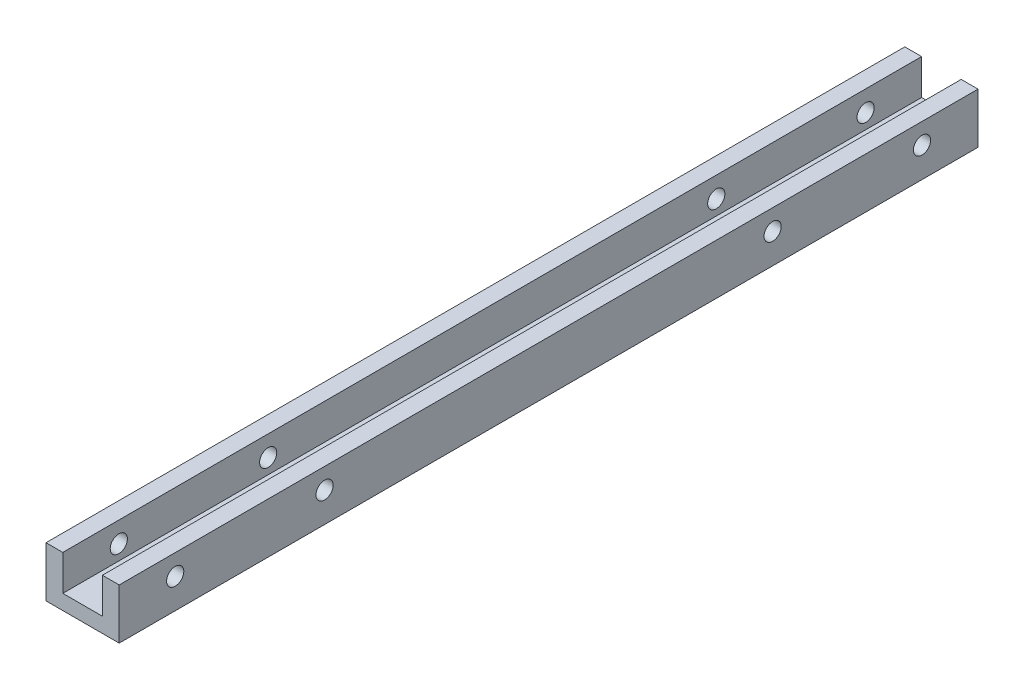
ISO-10303-21;
HEADER;
FILE_DESCRIPTION(('STEP AP214'),'2;1');
FILE_NAME('part.step','',(''),(''),'','','');
FILE_SCHEMA(('AUTOMOTIVE_DESIGN { 1 0 10303 214 1 1 1 1 }'));
ENDSEC;
DATA;
#1=APPLICATION_CONTEXT('core data for automotive mechanical design processes');
#2=APPLICATION_PROTOCOL_DEFINITION('international standard','automotive_design',2000,#1);
#3=PRODUCT_CONTEXT('',#1,'mechanical');
#4=PRODUCT('Part','Part','',(#3));
#5=PRODUCT_RELATED_PRODUCT_CATEGORY('part','',(#4));
#6=PRODUCT_DEFINITION_FORMATION('','',#4);
#7=PRODUCT_DEFINITION_CONTEXT('part definition',#1,'design');
#8=PRODUCT_DEFINITION('design','',#6,#7);
#9=PRODUCT_DEFINITION_SHAPE('','',#8);
#10=(LENGTH_UNIT() NAMED_UNIT(*) SI_UNIT(.MILLI.,.METRE.));
#11=(NAMED_UNIT(*) PLANE_ANGLE_UNIT() SI_UNIT($,.RADIAN.));
#12=(NAMED_UNIT(*) SI_UNIT($,.STERADIAN.) SOLID_ANGLE_UNIT());
#13=UNCERTAINTY_MEASURE_WITH_UNIT(LENGTH_MEASURE(1.E-05),#10,'distance_accuracy_value','');
#14=(GEOMETRIC_REPRESENTATION_CONTEXT(3) GLOBAL_UNCERTAINTY_ASSIGNED_CONTEXT((#13)) GLOBAL_UNIT_ASSIGNED_CONTEXT((#10,
#11,#12)) REPRESENTATION_CONTEXT('',''));
#15=CARTESIAN_POINT('',(0.,0.,0.));
#16=DIRECTION('',(0.,0.,1.));
#17=DIRECTION('',(1.,0.,0.));
#18=AXIS2_PLACEMENT_3D('',#15,#16,#17);
#19=CARTESIAN_POINT('',(0.,0.,230.));
#20=DIRECTION('',(0.,-1.,0.));
#21=DIRECTION('',(0.,0.,-1.));
#22=AXIS2_PLACEMENT_3D('',#19,#20,#21);
#23=PLANE('',#22);
#24=DIRECTION('',(-1.,0.,0.));
#25=VECTOR('',#24,1.);
#26=CARTESIAN_POINT('',(0.,0.,0.));
#27=LINE('',#26,#25);
#28=CARTESIAN_POINT('',(10.6,0.,0.));
#29=VERTEX_POINT('',#28);
#30=CARTESIAN_POINT('',(0.,0.,0.));
#31=VERTEX_POINT('',#30);
#32=EDGE_CURVE('E131',#29,#31,#27,.T.);
#33=ORIENTED_EDGE('',*,*,#32,.T.);
#34=DIRECTION('',(0.,0.,-1.));
#35=VECTOR('',#34,1.);
#36=CARTESIAN_POINT('',(0.,0.,230.));
#37=LINE('',#36,#35);
#38=CARTESIAN_POINT('',(0.,0.,230.));
#39=VERTEX_POINT('',#38);
#40=EDGE_CURVE('E11',#39,#31,#37,.T.);
#41=ORIENTED_EDGE('',*,*,#40,.F.);
#42=DIRECTION('',(-1.,0.,0.));
#43=VECTOR('',#42,1.);
#44=CARTESIAN_POINT('',(0.,0.,230.));
#45=LINE('',#44,#43);
#46=CARTESIAN_POINT('',(10.6,0.,230.));
#47=VERTEX_POINT('',#46);
#48=EDGE_CURVE('E146',#47,#39,#45,.T.);
#49=ORIENTED_EDGE('',*,*,#48,.F.);
#50=DIRECTION('',(0.,0.,-1.));
#51=VECTOR('',#50,1.);
#52=CARTESIAN_POINT('',(10.6,0.,230.));
#53=LINE('',#52,#51);
#54=EDGE_CURVE('E127',#47,#29,#53,.T.);
#55=ORIENTED_EDGE('',*,*,#54,.T.);
#56=EDGE_LOOP('',(#33,#41,#49,#55));
#57=FACE_BOUND('',#56,.T.);
#58=ADVANCED_FACE('F33',(#57),#23,.F.);
#59=CARTESIAN_POINT('',(0.,0.,230.));
#60=DIRECTION('',(-1.,0.,0.));
#61=DIRECTION('',(0.,0.,1.));
#62=AXIS2_PLACEMENT_3D('',#59,#60,#61);
#63=PLANE('',#62);
#64=CARTESIAN_POINT('',(0.,3.99999999999998,215.));
#65=DIRECTION('',(-1.,0.,0.));
#66=DIRECTION('',(0.,0.,1.));
#67=AXIS2_PLACEMENT_3D('',#64,#65,#66);
#68=CIRCLE('',#67,2.30000000000001);
#69=CARTESIAN_POINT('',(0.,3.99999999999998,217.3));
#70=VERTEX_POINT('',#69);
#71=EDGE_CURVE('E135',#70,#70,#68,.T.);
#72=ORIENTED_EDGE('',*,*,#71,.T.);
#73=EDGE_LOOP('',(#72));
#74=FACE_BOUND('',#73,.T.);
#75=CARTESIAN_POINT('',(0.,3.99999999999998,175.));
#76=DIRECTION('',(-1.,0.,0.));
#77=DIRECTION('',(0.,0.,1.));
#78=AXIS2_PLACEMENT_3D('',#75,#76,#77);
#79=CIRCLE('',#78,2.30000000000001);
#80=CARTESIAN_POINT('',(0.,3.99999999999998,177.3));
#81=VERTEX_POINT('',#80);
#82=EDGE_CURVE('E174',#81,#81,#79,.T.);
#83=ORIENTED_EDGE('',*,*,#82,.T.);
#84=EDGE_LOOP('',(#83));
#85=FACE_BOUND('',#84,.T.);
#86=CARTESIAN_POINT('',(0.,3.99999999999998,54.9999999999999));
#87=DIRECTION('',(-1.,0.,0.));
#88=DIRECTION('',(0.,0.,1.));
#89=AXIS2_PLACEMENT_3D('',#86,#87,#88);
#90=CIRCLE('',#89,2.3);
#91=CARTESIAN_POINT('',(0.,3.99999999999998,57.2999999999999));
#92=VERTEX_POINT('',#91);
#93=EDGE_CURVE('E170',#92,#92,#90,.T.);
#94=ORIENTED_EDGE('',*,*,#93,.T.);
#95=EDGE_LOOP('',(#94));
#96=FACE_BOUND('',#95,.T.);
#97=CARTESIAN_POINT('',(0.,3.99999999999998,14.9999999999999));
#98=DIRECTION('',(-1.,0.,0.));
#99=DIRECTION('',(0.,0.,1.));
#100=AXIS2_PLACEMENT_3D('',#97,#98,#99);
#101=CIRCLE('',#100,2.3);
#102=CARTESIAN_POINT('',(0.,3.99999999999998,17.2999999999999));
#103=VERTEX_POINT('',#102);
#104=EDGE_CURVE('E166',#103,#103,#101,.T.);
#105=ORIENTED_EDGE('',*,*,#104,.T.);
#106=EDGE_LOOP('',(#105));
#107=FACE_BOUND('',#106,.T.);
#108=DIRECTION('',(0.,1.,0.));
#109=VECTOR('',#108,1.);
#110=CARTESIAN_POINT('',(0.,0.,0.));
#111=LINE('',#110,#109);
#112=CARTESIAN_POINT('',(0.,9.5,0.));
#113=VERTEX_POINT('',#112);
#114=EDGE_CURVE('E134',#31,#113,#111,.T.);
#115=ORIENTED_EDGE('',*,*,#114,.T.);
#116=DIRECTION('',(0.,0.,-1.));
#117=VECTOR('',#116,1.);
#118=CARTESIAN_POINT('',(0.,9.5,230.));
#119=LINE('',#118,#117);
#120=CARTESIAN_POINT('',(0.,9.5,230.));
#121=VERTEX_POINT('',#120);
#122=EDGE_CURVE('E42',#121,#113,#119,.T.);
#123=ORIENTED_EDGE('',*,*,#122,.F.);
#124=DIRECTION('',(0.,1.,0.));
#125=VECTOR('',#124,1.);
#126=CARTESIAN_POINT('',(0.,0.,230.));
#127=LINE('',#126,#125);
#128=EDGE_CURVE('E94',#39,#121,#127,.T.);
#129=ORIENTED_EDGE('',*,*,#128,.F.);
#130=ORIENTED_EDGE('',*,*,#40,.T.);
#131=EDGE_LOOP('',(#115,#123,#129,#130));
#132=FACE_BOUND('',#131,.T.);
#133=ADVANCED_FACE('F226',(#74,#85,#96,#107,#132),#63,.F.);
#134=CARTESIAN_POINT('',(-4.5,9.5,230.));
#135=DIRECTION('',(0.,-1.,0.));
#136=DIRECTION('',(0.,0.,-1.));
#137=AXIS2_PLACEMENT_3D('',#134,#135,#136);
#138=PLANE('',#137);
#139=DIRECTION('',(-1.,0.,0.));
#140=VECTOR('',#139,1.);
#141=CARTESIAN_POINT('',(-4.5,9.5,0.));
#142=LINE('',#141,#140);
#143=CARTESIAN_POINT('',(-4.5,9.5,0.));
#144=VERTEX_POINT('',#143);
#145=EDGE_CURVE('E137',#113,#144,#142,.T.);
#146=ORIENTED_EDGE('',*,*,#145,.T.);
#147=DIRECTION('',(0.,0.,-1.));
#148=VECTOR('',#147,1.);
#149=CARTESIAN_POINT('',(-4.5,9.5,230.));
#150=LINE('',#149,#148);
#151=CARTESIAN_POINT('',(-4.5,9.5,230.));
#152=VERTEX_POINT('',#151);
#153=EDGE_CURVE('E153',#152,#144,#150,.T.);
#154=ORIENTED_EDGE('',*,*,#153,.F.);
#155=DIRECTION('',(-1.,0.,0.));
#156=VECTOR('',#155,1.);
#157=CARTESIAN_POINT('',(-4.5,9.5,230.));
#158=LINE('',#157,#156);
#159=EDGE_CURVE('E193',#121,#152,#158,.T.);
#160=ORIENTED_EDGE('',*,*,#159,.F.);
#161=ORIENTED_EDGE('',*,*,#122,.T.);
#162=EDGE_LOOP('',(#146,#154,#160,#161));
#163=FACE_BOUND('',#162,.T.);
#164=ADVANCED_FACE('F230',(#163),#138,.F.);
#165=CARTESIAN_POINT('',(-4.5,-4.,230.));
#166=DIRECTION('',(1.,0.,0.));
#167=DIRECTION('',(0.,0.,-1.));
#168=AXIS2_PLACEMENT_3D('',#165,#166,#167);
#169=PLANE('',#168);
#170=CARTESIAN_POINT('',(-4.5,3.99999999999998,215.));
#171=DIRECTION('',(1.,0.,0.));
#172=DIRECTION('',(0.,0.,-1.));
#173=AXIS2_PLACEMENT_3D('',#170,#171,#172);
#174=CIRCLE('',#173,2.30000000000001);
#175=CARTESIAN_POINT('',(-4.5,3.99999999999998,212.7));
#176=VERTEX_POINT('',#175);
#177=EDGE_CURVE('E186',#176,#176,#174,.T.);
#178=ORIENTED_EDGE('',*,*,#177,.T.);
#179=EDGE_LOOP('',(#178));
#180=FACE_BOUND('',#179,.T.);
#181=CARTESIAN_POINT('',(-4.5,3.99999999999998,175.));
#182=DIRECTION('',(1.,0.,0.));
#183=DIRECTION('',(0.,0.,-1.));
#184=AXIS2_PLACEMENT_3D('',#181,#182,#183);
#185=CIRCLE('',#184,2.30000000000001);
#186=CARTESIAN_POINT('',(-4.5,3.99999999999998,172.7));
#187=VERTEX_POINT('',#186);
#188=EDGE_CURVE('E169',#187,#187,#185,.T.);
#189=ORIENTED_EDGE('',*,*,#188,.T.);
#190=EDGE_LOOP('',(#189));
#191=FACE_BOUND('',#190,.T.);
#192=CARTESIAN_POINT('',(-4.5,3.99999999999998,54.9999999999999));
#193=DIRECTION('',(1.,0.,0.));
#194=DIRECTION('',(0.,0.,-1.));
#195=AXIS2_PLACEMENT_3D('',#192,#193,#194);
#196=CIRCLE('',#195,2.3);
#197=CARTESIAN_POINT('',(-4.5,3.99999999999998,52.6999999999999));
#198=VERTEX_POINT('',#197);
#199=EDGE_CURVE('E165',#198,#198,#196,.T.);
#200=ORIENTED_EDGE('',*,*,#199,.T.);
#201=EDGE_LOOP('',(#200));
#202=FACE_BOUND('',#201,.T.);
#203=CARTESIAN_POINT('',(-4.5,3.99999999999998,14.9999999999999));
#204=DIRECTION('',(1.,0.,0.));
#205=DIRECTION('',(0.,0.,-1.));
#206=AXIS2_PLACEMENT_3D('',#203,#204,#205);
#207=CIRCLE('',#206,2.3);
#208=CARTESIAN_POINT('',(-4.5,3.99999999999998,12.6999999999999));
#209=VERTEX_POINT('',#208);
#210=EDGE_CURVE('E161',#209,#209,#207,.T.);
#211=ORIENTED_EDGE('',*,*,#210,.T.);
#212=EDGE_LOOP('',(#211));
#213=FACE_BOUND('',#212,.T.);
#214=DIRECTION('',(0.,-1.,0.));
#215=VECTOR('',#214,1.);
#216=CARTESIAN_POINT('',(-4.5,-4.,0.));
#217=LINE('',#216,#215);
#218=CARTESIAN_POINT('',(-4.5,-4.,0.));
#219=VERTEX_POINT('',#218);
#220=EDGE_CURVE('E139',#144,#219,#217,.T.);
#221=ORIENTED_EDGE('',*,*,#220,.T.);
#222=DIRECTION('',(0.,0.,-1.));
#223=VECTOR('',#222,1.);
#224=CARTESIAN_POINT('',(-4.5,-4.,230.));
#225=LINE('',#224,#223);
#226=CARTESIAN_POINT('',(-4.5,-4.,230.));
#227=VERTEX_POINT('',#226);
#228=EDGE_CURVE('E150',#227,#219,#225,.T.);
#229=ORIENTED_EDGE('',*,*,#228,.F.);
#230=DIRECTION('',(0.,-1.,0.));
#231=VECTOR('',#230,1.);
#232=CARTESIAN_POINT('',(-4.5,-4.,230.));
#233=LINE('',#232,#231);
#234=EDGE_CURVE('E195',#152,#227,#233,.T.);
#235=ORIENTED_EDGE('',*,*,#234,.F.);
#236=ORIENTED_EDGE('',*,*,#153,.T.);
#237=EDGE_LOOP('',(#221,#229,#235,#236));
#238=FACE_BOUND('',#237,.T.);
#239=ADVANCED_FACE('F201',(#180,#191,#202,#213,#238),#169,.F.);
#240=CARTESIAN_POINT('',(15.1,-4.,230.));
#241=DIRECTION('',(0.,1.,0.));
#242=DIRECTION('',(-1.,0.,0.));
#243=AXIS2_PLACEMENT_3D('',#240,#241,#242);
#244=PLANE('',#243);
#245=DIRECTION('',(1.,0.,0.));
#246=VECTOR('',#245,1.);
#247=CARTESIAN_POINT('',(15.1,-4.,0.));
#248=LINE('',#247,#246);
#249=CARTESIAN_POINT('',(15.1,-4.,0.));
#250=VERTEX_POINT('',#249);
#251=EDGE_CURVE('E141',#219,#250,#248,.T.);
#252=ORIENTED_EDGE('',*,*,#251,.T.);
#253=DIRECTION('',(0.,0.,-1.));
#254=VECTOR('',#253,1.);
#255=CARTESIAN_POINT('',(15.1,-4.,230.));
#256=LINE('',#255,#254);
#257=CARTESIAN_POINT('',(15.1,-4.,230.));
#258=VERTEX_POINT('',#257);
#259=EDGE_CURVE('E122',#258,#250,#256,.T.);
#260=ORIENTED_EDGE('',*,*,#259,.F.);
#261=DIRECTION('',(1.,0.,0.));
#262=VECTOR('',#261,1.);
#263=CARTESIAN_POINT('',(15.1,-4.,230.));
#264=LINE('',#263,#262);
#265=EDGE_CURVE('E113',#227,#258,#264,.T.);
#266=ORIENTED_EDGE('',*,*,#265,.F.);
#267=ORIENTED_EDGE('',*,*,#228,.T.);
#268=EDGE_LOOP('',(#252,#260,#266,#267));
#269=FACE_BOUND('',#268,.T.);
#270=ADVANCED_FACE('F205',(#269),#244,.F.);
#271=CARTESIAN_POINT('',(15.1,9.5,230.));
#272=DIRECTION('',(-1.,0.,0.));
#273=DIRECTION('',(0.,-1.,0.));
#274=AXIS2_PLACEMENT_3D('',#271,#272,#273);
#275=PLANE('',#274);
#276=CARTESIAN_POINT('',(15.1,3.99999999999998,215.));
#277=DIRECTION('',(1.,0.,0.));
#278=DIRECTION('',(0.,1.,0.));
#279=AXIS2_PLACEMENT_3D('',#276,#277,#278);
#280=CIRCLE('',#279,2.30000000000001);
#281=CARTESIAN_POINT('',(15.1,6.29999999999999,215.));
#282=VERTEX_POINT('',#281);
#283=EDGE_CURVE('E162',#282,#282,#280,.T.);
#284=ORIENTED_EDGE('',*,*,#283,.F.);
#285=EDGE_LOOP('',(#284));
#286=FACE_BOUND('',#285,.T.);
#287=CARTESIAN_POINT('',(15.1,3.99999999999999,175.));
#288=DIRECTION('',(1.,0.,0.));
#289=DIRECTION('',(0.,1.,0.));
#290=AXIS2_PLACEMENT_3D('',#287,#288,#289);
#291=CIRCLE('',#290,2.30000000000001);
#292=CARTESIAN_POINT('',(15.1,6.29999999999999,175.));
#293=VERTEX_POINT('',#292);
#294=EDGE_CURVE('E254',#293,#293,#291,.T.);
#295=ORIENTED_EDGE('',*,*,#294,.F.);
#296=EDGE_LOOP('',(#295));
#297=FACE_BOUND('',#296,.T.);
#298=CARTESIAN_POINT('',(15.1,3.99999999999998,54.9999999999999));
#299=DIRECTION('',(1.,0.,0.));
#300=DIRECTION('',(0.,1.,0.));
#301=AXIS2_PLACEMENT_3D('',#298,#299,#300);
#302=CIRCLE('',#301,2.3);
#303=CARTESIAN_POINT('',(15.1,6.29999999999998,54.9999999999999));
#304=VERTEX_POINT('',#303);
#305=EDGE_CURVE('E258',#304,#304,#302,.T.);
#306=ORIENTED_EDGE('',*,*,#305,.F.);
#307=EDGE_LOOP('',(#306));
#308=FACE_BOUND('',#307,.T.);
#309=CARTESIAN_POINT('',(15.1,3.99999999999998,14.9999999999999));
#310=DIRECTION('',(1.,0.,0.));
#311=DIRECTION('',(0.,1.,0.));
#312=AXIS2_PLACEMENT_3D('',#309,#310,#311);
#313=CIRCLE('',#312,2.3);
#314=CARTESIAN_POINT('',(15.1,6.29999999999998,14.9999999999999));
#315=VERTEX_POINT('',#314);
#316=EDGE_CURVE('E261',#315,#315,#313,.T.);
#317=ORIENTED_EDGE('',*,*,#316,.F.);
#318=EDGE_LOOP('',(#317));
#319=FACE_BOUND('',#318,.T.);
#320=DIRECTION('',(0.,1.,0.));
#321=VECTOR('',#320,1.);
#322=CARTESIAN_POINT('',(15.1,9.5,0.));
#323=LINE('',#322,#321);
#324=CARTESIAN_POINT('',(15.1,9.5,0.));
#325=VERTEX_POINT('',#324);
#326=EDGE_CURVE('E121',#250,#325,#323,.T.);
#327=ORIENTED_EDGE('',*,*,#326,.T.);
#328=DIRECTION('',(0.,0.,-1.));
#329=VECTOR('',#328,1.);
#330=CARTESIAN_POINT('',(15.1,9.5,230.));
#331=LINE('',#330,#329);
#332=CARTESIAN_POINT('',(15.1,9.5,230.));
#333=VERTEX_POINT('',#332);
#334=EDGE_CURVE('E118',#333,#325,#331,.T.);
#335=ORIENTED_EDGE('',*,*,#334,.F.);
#336=DIRECTION('',(0.,1.,0.));
#337=VECTOR('',#336,1.);
#338=CARTESIAN_POINT('',(15.1,9.5,230.));
#339=LINE('',#338,#337);
#340=EDGE_CURVE('E107',#258,#333,#339,.T.);
#341=ORIENTED_EDGE('',*,*,#340,.F.);
#342=ORIENTED_EDGE('',*,*,#259,.T.);
#343=EDGE_LOOP('',(#327,#335,#341,#342));
#344=FACE_BOUND('',#343,.T.);
#345=ADVANCED_FACE('F119',(#286,#297,#308,#319,#344),#275,.F.);
#346=CARTESIAN_POINT('',(10.6,9.5,230.));
#347=DIRECTION('',(0.,-1.,0.));
#348=DIRECTION('',(0.,0.,-1.));
#349=AXIS2_PLACEMENT_3D('',#346,#347,#348);
#350=PLANE('',#349);
#351=DIRECTION('',(-1.,0.,0.));
#352=VECTOR('',#351,1.);
#353=CARTESIAN_POINT('',(10.6,9.5,0.));
#354=LINE('',#353,#352);
#355=CARTESIAN_POINT('',(10.6,9.5,0.));
#356=VERTEX_POINT('',#355);
#357=EDGE_CURVE('E80',#325,#356,#354,.T.);
#358=ORIENTED_EDGE('',*,*,#357,.T.);
#359=DIRECTION('',(0.,0.,-1.));
#360=VECTOR('',#359,1.);
#361=CARTESIAN_POINT('',(10.6,9.5,230.));
#362=LINE('',#361,#360);
#363=CARTESIAN_POINT('',(10.6,9.5,230.));
#364=VERTEX_POINT('',#363);
#365=EDGE_CURVE('E123',#364,#356,#362,.T.);
#366=ORIENTED_EDGE('',*,*,#365,.F.);
#367=DIRECTION('',(-1.,0.,0.));
#368=VECTOR('',#367,1.);
#369=CARTESIAN_POINT('',(10.6,9.5,230.));
#370=LINE('',#369,#368);
#371=EDGE_CURVE('E111',#333,#364,#370,.T.);
#372=ORIENTED_EDGE('',*,*,#371,.F.);
#373=ORIENTED_EDGE('',*,*,#334,.T.);
#374=EDGE_LOOP('',(#358,#366,#372,#373));
#375=FACE_BOUND('',#374,.T.);
#376=ADVANCED_FACE('F125',(#375),#350,.F.);
#377=CARTESIAN_POINT('',(10.6,0.,230.));
#378=DIRECTION('',(1.,0.,0.));
#379=DIRECTION('',(0.,0.,-1.));
#380=AXIS2_PLACEMENT_3D('',#377,#378,#379);
#381=PLANE('',#380);
#382=CARTESIAN_POINT('',(10.6,3.99999999999998,215.));
#383=DIRECTION('',(1.,0.,0.));
#384=DIRECTION('',(0.,0.,-1.));
#385=AXIS2_PLACEMENT_3D('',#382,#383,#384);
#386=CIRCLE('',#385,2.30000000000001);
#387=CARTESIAN_POINT('',(10.6,3.99999999999998,212.7));
#388=VERTEX_POINT('',#387);
#389=EDGE_CURVE('E36',#388,#388,#386,.T.);
#390=ORIENTED_EDGE('',*,*,#389,.T.);
#391=EDGE_LOOP('',(#390));
#392=FACE_BOUND('',#391,.T.);
#393=CARTESIAN_POINT('',(10.6,3.99999999999999,175.));
#394=DIRECTION('',(1.,0.,0.));
#395=DIRECTION('',(0.,0.,-1.));
#396=AXIS2_PLACEMENT_3D('',#393,#394,#395);
#397=CIRCLE('',#396,2.30000000000001);
#398=CARTESIAN_POINT('',(10.6,3.99999999999999,172.7));
#399=VERTEX_POINT('',#398);
#400=EDGE_CURVE('E167',#399,#399,#397,.T.);
#401=ORIENTED_EDGE('',*,*,#400,.T.);
#402=EDGE_LOOP('',(#401));
#403=FACE_BOUND('',#402,.T.);
#404=CARTESIAN_POINT('',(10.6,3.99999999999998,54.9999999999999));
#405=DIRECTION('',(1.,0.,0.));
#406=DIRECTION('',(0.,0.,-1.));
#407=AXIS2_PLACEMENT_3D('',#404,#405,#406);
#408=CIRCLE('',#407,2.3);
#409=CARTESIAN_POINT('',(10.6,3.99999999999998,52.6999999999999));
#410=VERTEX_POINT('',#409);
#411=EDGE_CURVE('E163',#410,#410,#408,.T.);
#412=ORIENTED_EDGE('',*,*,#411,.T.);
#413=EDGE_LOOP('',(#412));
#414=FACE_BOUND('',#413,.T.);
#415=CARTESIAN_POINT('',(10.6,3.99999999999998,14.9999999999999));
#416=DIRECTION('',(1.,0.,0.));
#417=DIRECTION('',(0.,0.,-1.));
#418=AXIS2_PLACEMENT_3D('',#415,#416,#417);
#419=CIRCLE('',#418,2.3);
#420=CARTESIAN_POINT('',(10.6,3.99999999999998,12.6999999999999));
#421=VERTEX_POINT('',#420);
#422=EDGE_CURVE('E158',#421,#421,#419,.T.);
#423=ORIENTED_EDGE('',*,*,#422,.T.);
#424=EDGE_LOOP('',(#423));
#425=FACE_BOUND('',#424,.T.);
#426=DIRECTION('',(0.,-1.,0.));
#427=VECTOR('',#426,1.);
#428=CARTESIAN_POINT('',(10.6,0.,0.));
#429=LINE('',#428,#427);
#430=EDGE_CURVE('E86',#356,#29,#429,.T.);
#431=ORIENTED_EDGE('',*,*,#430,.T.);
#432=ORIENTED_EDGE('',*,*,#54,.F.);
#433=DIRECTION('',(0.,-1.,0.));
#434=VECTOR('',#433,1.);
#435=CARTESIAN_POINT('',(10.6,0.,230.));
#436=LINE('',#435,#434);
#437=EDGE_CURVE('E51',#364,#47,#436,.T.);
#438=ORIENTED_EDGE('',*,*,#437,.F.);
#439=ORIENTED_EDGE('',*,*,#365,.T.);
#440=EDGE_LOOP('',(#431,#432,#438,#439));
#441=FACE_BOUND('',#440,.T.);
#442=ADVANCED_FACE('F213',(#392,#403,#414,#425,#441),#381,.F.);
#443=CARTESIAN_POINT('',(0.,0.,230.));
#444=DIRECTION('',(0.,0.,1.));
#445=DIRECTION('',(1.,0.,0.));
#446=AXIS2_PLACEMENT_3D('',#443,#444,#445);
#447=PLANE('',#446);
#448=ORIENTED_EDGE('',*,*,#48,.T.);
#449=ORIENTED_EDGE('',*,*,#128,.T.);
#450=ORIENTED_EDGE('',*,*,#159,.T.);
#451=ORIENTED_EDGE('',*,*,#234,.T.);
#452=ORIENTED_EDGE('',*,*,#265,.T.);
#453=ORIENTED_EDGE('',*,*,#340,.T.);
#454=ORIENTED_EDGE('',*,*,#371,.T.);
#455=ORIENTED_EDGE('',*,*,#437,.T.);
#456=EDGE_LOOP('',(#448,#449,#450,#451,#452,#453,#454,#455));
#457=FACE_BOUND('',#456,.T.);
#458=ADVANCED_FACE('F109',(#457),#447,.T.);
#459=CARTESIAN_POINT('',(0.,0.,0.));
#460=DIRECTION('',(0.,0.,1.));
#461=DIRECTION('',(1.,0.,0.));
#462=AXIS2_PLACEMENT_3D('',#459,#460,#461);
#463=PLANE('',#462);
#464=ORIENTED_EDGE('',*,*,#32,.F.);
#465=ORIENTED_EDGE('',*,*,#430,.F.);
#466=ORIENTED_EDGE('',*,*,#357,.F.);
#467=ORIENTED_EDGE('',*,*,#326,.F.);
#468=ORIENTED_EDGE('',*,*,#251,.F.);
#469=ORIENTED_EDGE('',*,*,#220,.F.);
#470=ORIENTED_EDGE('',*,*,#145,.F.);
#471=ORIENTED_EDGE('',*,*,#114,.F.);
#472=EDGE_LOOP('',(#464,#465,#466,#467,#468,#469,#470,#471));
#473=FACE_BOUND('',#472,.T.);
#474=ADVANCED_FACE('F208',(#473),#463,.F.);
#475=CARTESIAN_POINT('',(-214.9,3.99999999999996,14.9999999999999));
#476=DIRECTION('',(1.,0.,0.));
#477=DIRECTION('',(0.,1.,0.));
#478=AXIS2_PLACEMENT_3D('',#475,#476,#477);
#479=CYLINDRICAL_SURFACE('',#478,2.3);
#480=ORIENTED_EDGE('',*,*,#316,.T.);
#481=EDGE_LOOP('',(#480));
#482=FACE_BOUND('',#481,.T.);
#483=ORIENTED_EDGE('',*,*,#422,.F.);
#484=EDGE_LOOP('',(#483));
#485=FACE_BOUND('',#484,.T.);
#486=ADVANCED_FACE('F278',(#482,#485),#479,.F.);
#487=CARTESIAN_POINT('',(-214.9,3.99999999999996,54.9999999999999));
#488=DIRECTION('',(1.,0.,0.));
#489=DIRECTION('',(0.,1.,0.));
#490=AXIS2_PLACEMENT_3D('',#487,#488,#489);
#491=CYLINDRICAL_SURFACE('',#490,2.3);
#492=ORIENTED_EDGE('',*,*,#305,.T.);
#493=EDGE_LOOP('',(#492));
#494=FACE_BOUND('',#493,.T.);
#495=ORIENTED_EDGE('',*,*,#411,.F.);
#496=EDGE_LOOP('',(#495));
#497=FACE_BOUND('',#496,.T.);
#498=ADVANCED_FACE('F286',(#494,#497),#491,.F.);
#499=CARTESIAN_POINT('',(-214.9,3.99999999999996,175.));
#500=DIRECTION('',(1.,0.,0.));
#501=DIRECTION('',(0.,1.,0.));
#502=AXIS2_PLACEMENT_3D('',#499,#500,#501);
#503=CYLINDRICAL_SURFACE('',#502,2.30000000000001);
#504=ORIENTED_EDGE('',*,*,#294,.T.);
#505=EDGE_LOOP('',(#504));
#506=FACE_BOUND('',#505,.T.);
#507=ORIENTED_EDGE('',*,*,#400,.F.);
#508=EDGE_LOOP('',(#507));
#509=FACE_BOUND('',#508,.T.);
#510=ADVANCED_FACE('F287',(#506,#509),#503,.F.);
#511=CARTESIAN_POINT('',(-214.9,3.99999999999996,215.));
#512=DIRECTION('',(1.,0.,0.));
#513=DIRECTION('',(0.,1.,0.));
#514=AXIS2_PLACEMENT_3D('',#511,#512,#513);
#515=CYLINDRICAL_SURFACE('',#514,2.30000000000001);
#516=ORIENTED_EDGE('',*,*,#283,.T.);
#517=EDGE_LOOP('',(#516));
#518=FACE_BOUND('',#517,.T.);
#519=ORIENTED_EDGE('',*,*,#389,.F.);
#520=EDGE_LOOP('',(#519));
#521=FACE_BOUND('',#520,.T.);
#522=ADVANCED_FACE('F275',(#518,#521),#515,.F.);
#523=ORIENTED_EDGE('',*,*,#210,.F.);
#524=EDGE_LOOP('',(#523));
#525=FACE_BOUND('',#524,.T.);
#526=ORIENTED_EDGE('',*,*,#104,.F.);
#527=EDGE_LOOP('',(#526));
#528=FACE_BOUND('',#527,.T.);
#529=ADVANCED_FACE('F272',(#525,#528),#479,.F.);
#530=ORIENTED_EDGE('',*,*,#199,.F.);
#531=EDGE_LOOP('',(#530));
#532=FACE_BOUND('',#531,.T.);
#533=ORIENTED_EDGE('',*,*,#93,.F.);
#534=EDGE_LOOP('',(#533));
#535=FACE_BOUND('',#534,.T.);
#536=ADVANCED_FACE('F274',(#532,#535),#491,.F.);
#537=ORIENTED_EDGE('',*,*,#188,.F.);
#538=EDGE_LOOP('',(#537));
#539=FACE_BOUND('',#538,.T.);
#540=ORIENTED_EDGE('',*,*,#82,.F.);
#541=EDGE_LOOP('',(#540));
#542=FACE_BOUND('',#541,.T.);
#543=ADVANCED_FACE('F283',(#539,#542),#503,.F.);
#544=ORIENTED_EDGE('',*,*,#177,.F.);
#545=EDGE_LOOP('',(#544));
#546=FACE_BOUND('',#545,.T.);
#547=ORIENTED_EDGE('',*,*,#71,.F.);
#548=EDGE_LOOP('',(#547));
#549=FACE_BOUND('',#548,.T.);
#550=ADVANCED_FACE('F290',(#546,#549),#515,.F.);
#551=CLOSED_SHELL('',(#58,#133,#164,#239,#270,#345,#376,#442,#458,#474,#486,#498,#510,#522,#529,
#536,#543,#550));
#552=MANIFOLD_SOLID_BREP('B2',#551);
#553=ADVANCED_BREP_SHAPE_REPRESENTATION('',(#18,#552),#14);
#554=SHAPE_DEFINITION_REPRESENTATION(#9,#553);
ENDSEC;
END-ISO-10303-21;
